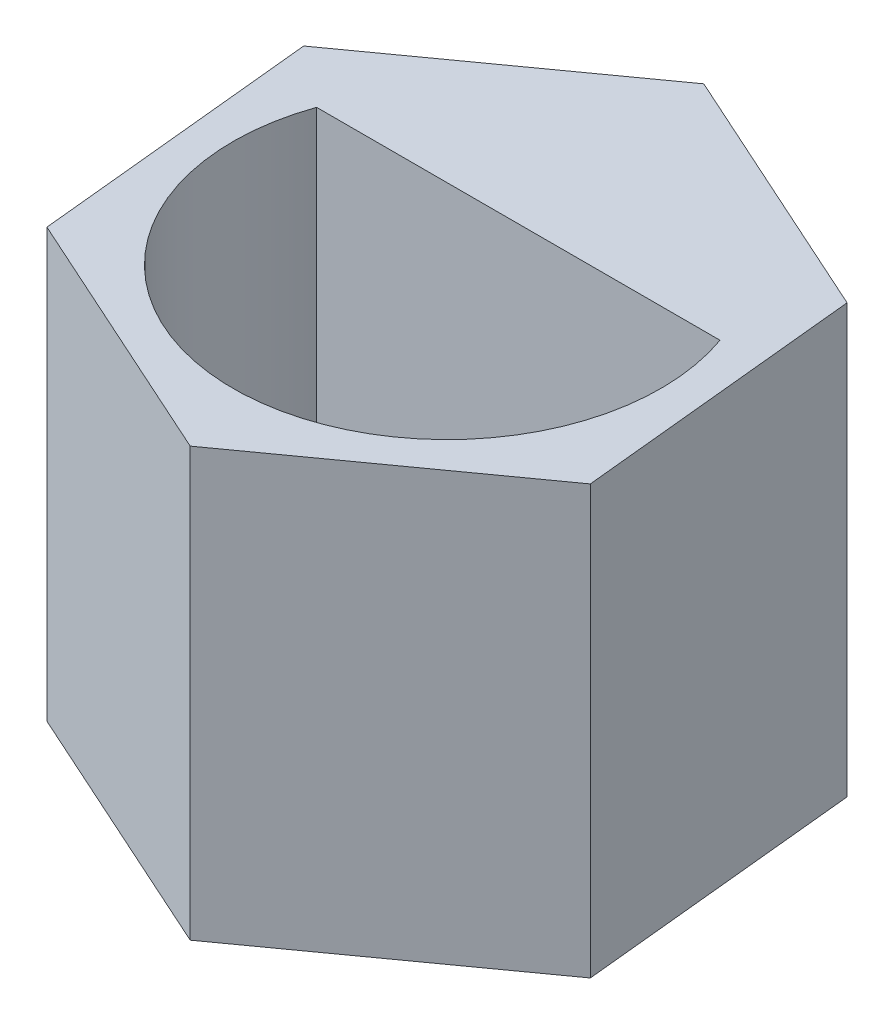
ISO-10303-21;
HEADER;
FILE_DESCRIPTION(('STEP AP214'),'2;1');
FILE_NAME('part.step','',(''),(''),'','','');
FILE_SCHEMA(('AUTOMOTIVE_DESIGN { 1 0 10303 214 1 1 1 1 }'));
ENDSEC;
DATA;
#1=APPLICATION_CONTEXT('core data for automotive mechanical design processes');
#2=APPLICATION_PROTOCOL_DEFINITION('international standard','automotive_design',2000,#1);
#3=PRODUCT_CONTEXT('',#1,'mechanical');
#4=PRODUCT('Part','Part','',(#3));
#5=PRODUCT_RELATED_PRODUCT_CATEGORY('part','',(#4));
#6=PRODUCT_DEFINITION_FORMATION('','',#4);
#7=PRODUCT_DEFINITION_CONTEXT('part definition',#1,'design');
#8=PRODUCT_DEFINITION('design','',#6,#7);
#9=PRODUCT_DEFINITION_SHAPE('','',#8);
#10=(LENGTH_UNIT() NAMED_UNIT(*) SI_UNIT(.MILLI.,.METRE.));
#11=(NAMED_UNIT(*) PLANE_ANGLE_UNIT() SI_UNIT($,.RADIAN.));
#12=(NAMED_UNIT(*) SI_UNIT($,.STERADIAN.) SOLID_ANGLE_UNIT());
#13=UNCERTAINTY_MEASURE_WITH_UNIT(LENGTH_MEASURE(1.E-05),#10,'distance_accuracy_value','');
#14=(GEOMETRIC_REPRESENTATION_CONTEXT(3) GLOBAL_UNCERTAINTY_ASSIGNED_CONTEXT((#13)) GLOBAL_UNIT_ASSIGNED_CONTEXT((#10,
#11,#12)) REPRESENTATION_CONTEXT('',''));
#15=CARTESIAN_POINT('',(0.,0.,0.));
#16=DIRECTION('',(0.,0.,1.));
#17=DIRECTION('',(1.,0.,0.));
#18=AXIS2_PLACEMENT_3D('',#15,#16,#17);
#19=CARTESIAN_POINT('',(0.,3.,0.));
#20=DIRECTION('',(0.,1.,0.));
#21=DIRECTION('',(0.,0.,1.));
#22=AXIS2_PLACEMENT_3D('',#19,#20,#21);
#23=PLANE('',#22);
#24=DIRECTION('',(0.81207988523823,0.,-0.583546279219963));
#25=VECTOR('',#24,1.);
#26=CARTESIAN_POINT('',(0.199639144464171,3.,2.));
#27=LINE('',#26,#25);
#28=CARTESIAN_POINT('',(0.199639144464171,3.,2.));
#29=VERTEX_POINT('',#28);
#30=CARTESIAN_POINT('',(1.83187037980096,3.,0.827107429304236));
#31=VERTEX_POINT('',#30);
#32=EDGE_CURVE('E118',#29,#31,#27,.T.);
#33=ORIENTED_EDGE('',*,*,#32,.T.);
#34=DIRECTION('',(-0.0993259594692602,0.,-0.99505495012864));
#35=VECTOR('',#34,1.);
#36=CARTESIAN_POINT('',(1.83187037980096,3.,0.827107429304236));
#37=LINE('',#36,#35);
#38=CARTESIAN_POINT('',(1.63223123533679,3.,-1.17289257069576));
#39=VERTEX_POINT('',#38);
#40=EDGE_CURVE('E121',#31,#39,#37,.T.);
#41=ORIENTED_EDGE('',*,*,#40,.T.);
#42=DIRECTION('',(-0.91140584470749,0.,-0.411508670908677));
#43=VECTOR('',#42,1.);
#44=CARTESIAN_POINT('',(1.63223123533679,3.,-1.17289257069576));
#45=LINE('',#44,#43);
#46=CARTESIAN_POINT('',(-0.199639144464172,3.,-2.));
#47=VERTEX_POINT('',#46);
#48=EDGE_CURVE('E124',#39,#47,#45,.T.);
#49=ORIENTED_EDGE('',*,*,#48,.T.);
#50=DIRECTION('',(-0.81207988523823,0.,0.583546279219964));
#51=VECTOR('',#50,1.);
#52=CARTESIAN_POINT('',(-0.199639144464172,3.,-2.));
#53=LINE('',#52,#51);
#54=CARTESIAN_POINT('',(-1.83187037980096,3.,-0.827107429304236));
#55=VERTEX_POINT('',#54);
#56=EDGE_CURVE('E126',#47,#55,#53,.T.);
#57=ORIENTED_EDGE('',*,*,#56,.T.);
#58=DIRECTION('',(0.0993259594692602,0.,0.99505495012864));
#59=VECTOR('',#58,1.);
#60=CARTESIAN_POINT('',(-1.83187037980096,3.,-0.827107429304236));
#61=LINE('',#60,#59);
#62=CARTESIAN_POINT('',(-1.63223123533679,3.,1.17289257069576));
#63=VERTEX_POINT('',#62);
#64=EDGE_CURVE('E128',#55,#63,#61,.T.);
#65=ORIENTED_EDGE('',*,*,#64,.T.);
#66=DIRECTION('',(0.91140584470749,0.,0.411508670908677));
#67=VECTOR('',#66,1.);
#68=CARTESIAN_POINT('',(-1.63223123533679,3.,1.17289257069576));
#69=LINE('',#68,#67);
#70=EDGE_CURVE('E130',#63,#29,#69,.T.);
#71=ORIENTED_EDGE('',*,*,#70,.T.);
#72=EDGE_LOOP('',(#33,#41,#49,#57,#65,#71));
#73=FACE_BOUND('',#72,.T.);
#74=DIRECTION('',(-1.,0.,0.));
#75=VECTOR('',#74,1.);
#76=CARTESIAN_POINT('',(-1.41421356237309,3.,-0.5));
#77=LINE('',#76,#75);
#78=CARTESIAN_POINT('',(1.41421356237309,3.,-0.5));
#79=VERTEX_POINT('',#78);
#80=CARTESIAN_POINT('',(-1.41421356237309,3.,-0.5));
#81=VERTEX_POINT('',#80);
#82=EDGE_CURVE('E101',#79,#81,#77,.T.);
#83=ORIENTED_EDGE('',*,*,#82,.F.);
#84=CARTESIAN_POINT('',(0.,3.,0.));
#85=DIRECTION('',(0.,1.,0.));
#86=DIRECTION('',(0.,0.,1.));
#87=AXIS2_PLACEMENT_3D('',#84,#85,#86);
#88=CIRCLE('',#87,1.5);
#89=EDGE_CURVE('E107',#81,#79,#88,.T.);
#90=ORIENTED_EDGE('',*,*,#89,.F.);
#91=EDGE_LOOP('',(#83,#90));
#92=FACE_BOUND('',#91,.T.);
#93=ADVANCED_FACE('F37',(#73,#92),#23,.T.);
#94=CARTESIAN_POINT('',(0.,0.,0.));
#95=DIRECTION('',(0.,1.,0.));
#96=DIRECTION('',(0.,0.,1.));
#97=AXIS2_PLACEMENT_3D('',#94,#95,#96);
#98=PLANE('',#97);
#99=DIRECTION('',(0.81207988523823,0.,-0.583546279219963));
#100=VECTOR('',#99,1.);
#101=CARTESIAN_POINT('',(0.199639144464171,0.,2.));
#102=LINE('',#101,#100);
#103=CARTESIAN_POINT('',(0.199639144464171,0.,2.));
#104=VERTEX_POINT('',#103);
#105=CARTESIAN_POINT('',(1.83187037980096,0.,0.827107429304236));
#106=VERTEX_POINT('',#105);
#107=EDGE_CURVE('E117',#104,#106,#102,.T.);
#108=ORIENTED_EDGE('',*,*,#107,.F.);
#109=DIRECTION('',(0.91140584470749,0.,0.411508670908677));
#110=VECTOR('',#109,1.);
#111=CARTESIAN_POINT('',(-1.63223123533679,0.,1.17289257069576));
#112=LINE('',#111,#110);
#113=CARTESIAN_POINT('',(-1.63223123533679,0.,1.17289257069576));
#114=VERTEX_POINT('',#113);
#115=EDGE_CURVE('E122',#114,#104,#112,.T.);
#116=ORIENTED_EDGE('',*,*,#115,.F.);
#117=DIRECTION('',(0.0993259594692602,0.,0.99505495012864));
#118=VECTOR('',#117,1.);
#119=CARTESIAN_POINT('',(-1.83187037980096,0.,-0.827107429304236));
#120=LINE('',#119,#118);
#121=CARTESIAN_POINT('',(-1.83187037980096,0.,-0.827107429304236));
#122=VERTEX_POINT('',#121);
#123=EDGE_CURVE('E141',#122,#114,#120,.T.);
#124=ORIENTED_EDGE('',*,*,#123,.F.);
#125=DIRECTION('',(-0.81207988523823,0.,0.583546279219964));
#126=VECTOR('',#125,1.);
#127=CARTESIAN_POINT('',(-0.199639144464172,0.,-2.));
#128=LINE('',#127,#126);
#129=CARTESIAN_POINT('',(-0.199639144464172,0.,-2.));
#130=VERTEX_POINT('',#129);
#131=EDGE_CURVE('E139',#130,#122,#128,.T.);
#132=ORIENTED_EDGE('',*,*,#131,.F.);
#133=DIRECTION('',(-0.91140584470749,0.,-0.411508670908677));
#134=VECTOR('',#133,1.);
#135=CARTESIAN_POINT('',(1.63223123533679,0.,-1.17289257069576));
#136=LINE('',#135,#134);
#137=CARTESIAN_POINT('',(1.63223123533679,0.,-1.17289257069576));
#138=VERTEX_POINT('',#137);
#139=EDGE_CURVE('E137',#138,#130,#136,.T.);
#140=ORIENTED_EDGE('',*,*,#139,.F.);
#141=DIRECTION('',(-0.0993259594692602,0.,-0.99505495012864));
#142=VECTOR('',#141,1.);
#143=CARTESIAN_POINT('',(1.83187037980096,0.,0.827107429304236));
#144=LINE('',#143,#142);
#145=EDGE_CURVE('E135',#106,#138,#144,.T.);
#146=ORIENTED_EDGE('',*,*,#145,.F.);
#147=EDGE_LOOP('',(#108,#116,#124,#132,#140,#146));
#148=FACE_BOUND('',#147,.T.);
#149=CARTESIAN_POINT('',(0.,0.,0.));
#150=DIRECTION('',(0.,1.,0.));
#151=DIRECTION('',(0.,0.,1.));
#152=AXIS2_PLACEMENT_3D('',#149,#150,#151);
#153=CIRCLE('',#152,1.5);
#154=CARTESIAN_POINT('',(-1.41421356237309,0.,-0.5));
#155=VERTEX_POINT('',#154);
#156=CARTESIAN_POINT('',(1.41421356237309,0.,-0.5));
#157=VERTEX_POINT('',#156);
#158=EDGE_CURVE('E59',#155,#157,#153,.T.);
#159=ORIENTED_EDGE('',*,*,#158,.T.);
#160=DIRECTION('',(-1.,0.,0.));
#161=VECTOR('',#160,1.);
#162=CARTESIAN_POINT('',(-1.41421356237309,0.,-0.5));
#163=LINE('',#162,#161);
#164=EDGE_CURVE('E111',#157,#155,#163,.T.);
#165=ORIENTED_EDGE('',*,*,#164,.T.);
#166=EDGE_LOOP('',(#159,#165));
#167=FACE_BOUND('',#166,.T.);
#168=ADVANCED_FACE('F165',(#148,#167),#98,.F.);
#169=CARTESIAN_POINT('',(0.199639144464171,3.,2.));
#170=DIRECTION('',(-0.583546279219963,0.,-0.81207988523823));
#171=DIRECTION('',(-0.81207988523823,0.,0.583546279219963));
#172=AXIS2_PLACEMENT_3D('',#169,#170,#171);
#173=PLANE('',#172);
#174=ORIENTED_EDGE('',*,*,#107,.T.);
#175=DIRECTION('',(0.,-1.,0.));
#176=VECTOR('',#175,1.);
#177=CARTESIAN_POINT('',(1.83187037980096,3.,0.827107429304236));
#178=LINE('',#177,#176);
#179=EDGE_CURVE('E11',#31,#106,#178,.T.);
#180=ORIENTED_EDGE('',*,*,#179,.F.);
#181=ORIENTED_EDGE('',*,*,#32,.F.);
#182=DIRECTION('',(0.,-1.,0.));
#183=VECTOR('',#182,1.);
#184=CARTESIAN_POINT('',(0.199639144464171,3.,2.));
#185=LINE('',#184,#183);
#186=EDGE_CURVE('E132',#29,#104,#185,.T.);
#187=ORIENTED_EDGE('',*,*,#186,.T.);
#188=EDGE_LOOP('',(#174,#180,#181,#187));
#189=FACE_BOUND('',#188,.T.);
#190=ADVANCED_FACE('F39',(#189),#173,.F.);
#191=CARTESIAN_POINT('',(1.83187037980096,3.,0.827107429304236));
#192=DIRECTION('',(-0.99505495012864,0.,0.0993259594692601));
#193=DIRECTION('',(0.0993259594692602,0.,0.99505495012864));
#194=AXIS2_PLACEMENT_3D('',#191,#192,#193);
#195=PLANE('',#194);
#196=ORIENTED_EDGE('',*,*,#145,.T.);
#197=DIRECTION('',(0.,-1.,0.));
#198=VECTOR('',#197,1.);
#199=CARTESIAN_POINT('',(1.63223123533679,3.,-1.17289257069576));
#200=LINE('',#199,#198);
#201=EDGE_CURVE('E45',#39,#138,#200,.T.);
#202=ORIENTED_EDGE('',*,*,#201,.F.);
#203=ORIENTED_EDGE('',*,*,#40,.F.);
#204=ORIENTED_EDGE('',*,*,#179,.T.);
#205=EDGE_LOOP('',(#196,#202,#203,#204));
#206=FACE_BOUND('',#205,.T.);
#207=ADVANCED_FACE('F182',(#206),#195,.F.);
#208=CARTESIAN_POINT('',(1.63223123533679,3.,-1.17289257069576));
#209=DIRECTION('',(-0.411508670908677,0.,0.911405844707491));
#210=DIRECTION('',(0.911405844707491,0.,0.411508670908677));
#211=AXIS2_PLACEMENT_3D('',#208,#209,#210);
#212=PLANE('',#211);
#213=ORIENTED_EDGE('',*,*,#139,.T.);
#214=DIRECTION('',(0.,-1.,0.));
#215=VECTOR('',#214,1.);
#216=CARTESIAN_POINT('',(-0.199639144464172,3.,-2.));
#217=LINE('',#216,#215);
#218=EDGE_CURVE('E152',#47,#130,#217,.T.);
#219=ORIENTED_EDGE('',*,*,#218,.F.);
#220=ORIENTED_EDGE('',*,*,#48,.F.);
#221=ORIENTED_EDGE('',*,*,#201,.T.);
#222=EDGE_LOOP('',(#213,#219,#220,#221));
#223=FACE_BOUND('',#222,.T.);
#224=ADVANCED_FACE('F159',(#223),#212,.F.);
#225=CARTESIAN_POINT('',(-0.199639144464172,3.,-2.));
#226=DIRECTION('',(0.583546279219963,0.,0.81207988523823));
#227=DIRECTION('',(0.81207988523823,0.,-0.583546279219964));
#228=AXIS2_PLACEMENT_3D('',#225,#226,#227);
#229=PLANE('',#228);
#230=ORIENTED_EDGE('',*,*,#131,.T.);
#231=DIRECTION('',(0.,-1.,0.));
#232=VECTOR('',#231,1.);
#233=CARTESIAN_POINT('',(-1.83187037980096,3.,-0.827107429304236));
#234=LINE('',#233,#232);
#235=EDGE_CURVE('E149',#55,#122,#234,.T.);
#236=ORIENTED_EDGE('',*,*,#235,.F.);
#237=ORIENTED_EDGE('',*,*,#56,.F.);
#238=ORIENTED_EDGE('',*,*,#218,.T.);
#239=EDGE_LOOP('',(#230,#236,#237,#238));
#240=FACE_BOUND('',#239,.T.);
#241=ADVANCED_FACE('F171',(#240),#229,.F.);
#242=CARTESIAN_POINT('',(-1.83187037980096,3.,-0.827107429304236));
#243=DIRECTION('',(0.99505495012864,0.,-0.0993259594692601));
#244=DIRECTION('',(-0.0993259594692602,0.,-0.99505495012864));
#245=AXIS2_PLACEMENT_3D('',#242,#243,#244);
#246=PLANE('',#245);
#247=ORIENTED_EDGE('',*,*,#123,.T.);
#248=DIRECTION('',(0.,-1.,0.));
#249=VECTOR('',#248,1.);
#250=CARTESIAN_POINT('',(-1.63223123533679,3.,1.17289257069576));
#251=LINE('',#250,#249);
#252=EDGE_CURVE('E146',#63,#114,#251,.T.);
#253=ORIENTED_EDGE('',*,*,#252,.F.);
#254=ORIENTED_EDGE('',*,*,#64,.F.);
#255=ORIENTED_EDGE('',*,*,#235,.T.);
#256=EDGE_LOOP('',(#247,#253,#254,#255));
#257=FACE_BOUND('',#256,.T.);
#258=ADVANCED_FACE('F175',(#257),#246,.F.);
#259=CARTESIAN_POINT('',(-1.63223123533679,3.,1.17289257069576));
#260=DIRECTION('',(0.411508670908677,0.,-0.91140584470749));
#261=DIRECTION('',(-0.91140584470749,0.,-0.411508670908677));
#262=AXIS2_PLACEMENT_3D('',#259,#260,#261);
#263=PLANE('',#262);
#264=ORIENTED_EDGE('',*,*,#115,.T.);
#265=ORIENTED_EDGE('',*,*,#186,.F.);
#266=ORIENTED_EDGE('',*,*,#70,.F.);
#267=ORIENTED_EDGE('',*,*,#252,.T.);
#268=EDGE_LOOP('',(#264,#265,#266,#267));
#269=FACE_BOUND('',#268,.T.);
#270=ADVANCED_FACE('F185',(#269),#263,.F.);
#271=CARTESIAN_POINT('',(0.,3.,0.));
#272=DIRECTION('',(0.,-1.,0.));
#273=DIRECTION('',(0.,0.,-1.));
#274=AXIS2_PLACEMENT_3D('',#271,#272,#273);
#275=CYLINDRICAL_SURFACE('',#274,1.5);
#276=ORIENTED_EDGE('',*,*,#158,.F.);
#277=DIRECTION('',(0.,-1.,0.));
#278=VECTOR('',#277,1.);
#279=CARTESIAN_POINT('',(-1.41421356237309,3.,-0.5));
#280=LINE('',#279,#278);
#281=EDGE_CURVE('E103',#81,#155,#280,.T.);
#282=ORIENTED_EDGE('',*,*,#281,.F.);
#283=ORIENTED_EDGE('',*,*,#89,.T.);
#284=DIRECTION('',(0.,-1.,0.));
#285=VECTOR('',#284,1.);
#286=CARTESIAN_POINT('',(1.41421356237309,3.,-0.5));
#287=LINE('',#286,#285);
#288=EDGE_CURVE('E52',#79,#157,#287,.T.);
#289=ORIENTED_EDGE('',*,*,#288,.T.);
#290=EDGE_LOOP('',(#276,#282,#283,#289));
#291=FACE_BOUND('',#290,.T.);
#292=ADVANCED_FACE('F109',(#291),#275,.F.);
#293=CARTESIAN_POINT('',(-1.41421356237309,3.,-0.5));
#294=DIRECTION('',(0.,0.,1.));
#295=DIRECTION('',(1.,0.,0.));
#296=AXIS2_PLACEMENT_3D('',#293,#294,#295);
#297=PLANE('',#296);
#298=ORIENTED_EDGE('',*,*,#164,.F.);
#299=ORIENTED_EDGE('',*,*,#288,.F.);
#300=ORIENTED_EDGE('',*,*,#82,.T.);
#301=ORIENTED_EDGE('',*,*,#281,.T.);
#302=EDGE_LOOP('',(#298,#299,#300,#301));
#303=FACE_BOUND('',#302,.T.);
#304=ADVANCED_FACE('F102',(#303),#297,.T.);
#305=CLOSED_SHELL('',(#93,#168,#190,#207,#224,#241,#258,#270,#292,#304));
#306=MANIFOLD_SOLID_BREP('B2',#305);
#307=ADVANCED_BREP_SHAPE_REPRESENTATION('',(#18,#306),#14);
#308=SHAPE_DEFINITION_REPRESENTATION(#9,#307);
ENDSEC;
END-ISO-10303-21;
